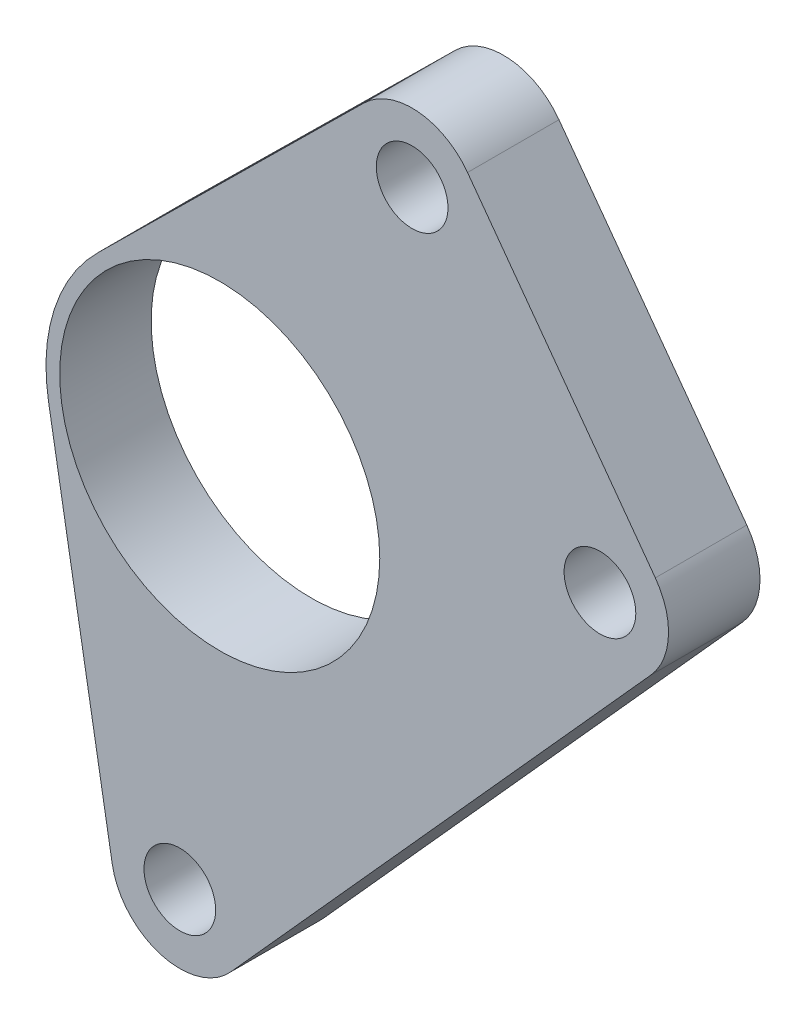
ISO-10303-21;
HEADER;
FILE_DESCRIPTION(('STEP AP214'),'2;1');
FILE_NAME('part.step','',(''),(''),'','','');
FILE_SCHEMA(('AUTOMOTIVE_DESIGN { 1 0 10303 214 1 1 1 1 }'));
ENDSEC;
DATA;
#1=APPLICATION_CONTEXT('core data for automotive mechanical design processes');
#2=APPLICATION_PROTOCOL_DEFINITION('international standard','automotive_design',2000,#1);
#3=PRODUCT_CONTEXT('',#1,'mechanical');
#4=PRODUCT('Part','Part','',(#3));
#5=PRODUCT_RELATED_PRODUCT_CATEGORY('part','',(#4));
#6=PRODUCT_DEFINITION_FORMATION('','',#4);
#7=PRODUCT_DEFINITION_CONTEXT('part definition',#1,'design');
#8=PRODUCT_DEFINITION('design','',#6,#7);
#9=PRODUCT_DEFINITION_SHAPE('','',#8);
#10=(LENGTH_UNIT() NAMED_UNIT(*) SI_UNIT(.MILLI.,.METRE.));
#11=(NAMED_UNIT(*) PLANE_ANGLE_UNIT() SI_UNIT($,.RADIAN.));
#12=(NAMED_UNIT(*) SI_UNIT($,.STERADIAN.) SOLID_ANGLE_UNIT());
#13=UNCERTAINTY_MEASURE_WITH_UNIT(LENGTH_MEASURE(1.E-05),#10,'distance_accuracy_value','');
#14=(GEOMETRIC_REPRESENTATION_CONTEXT(3) GLOBAL_UNCERTAINTY_ASSIGNED_CONTEXT((#13)) GLOBAL_UNIT_ASSIGNED_CONTEXT((#10,
#11,#12)) REPRESENTATION_CONTEXT('',''));
#15=CARTESIAN_POINT('',(0.,0.,0.));
#16=DIRECTION('',(0.,0.,1.));
#17=DIRECTION('',(1.,0.,0.));
#18=AXIS2_PLACEMENT_3D('',#15,#16,#17);
#19=CARTESIAN_POINT('',(-12.0465578661128,189.428701429059,6.35));
#20=DIRECTION('',(0.,0.,1.));
#21=DIRECTION('',(1.,0.,0.));
#22=AXIS2_PLACEMENT_3D('',#19,#20,#21);
#23=PLANE('',#22);
#24=CARTESIAN_POINT('',(17.1253729645223,221.865892196908,6.35));
#25=DIRECTION('',(0.,0.,1.));
#26=DIRECTION('',(1.,0.,0.));
#27=AXIS2_PLACEMENT_3D('',#24,#25,#26);
#28=CIRCLE('',#27,2.48920000000001);
#29=CARTESIAN_POINT('',(19.6145729645223,221.865892196908,6.35));
#30=VERTEX_POINT('',#29);
#31=EDGE_CURVE('E194',#30,#30,#28,.T.);
#32=ORIENTED_EDGE('',*,*,#31,.F.);
#33=EDGE_LOOP('',(#32));
#34=FACE_BOUND('',#33,.T.);
#35=CARTESIAN_POINT('',(-9.27636887368145,216.273648983416,6.35));
#36=DIRECTION('',(0.,0.,1.));
#37=DIRECTION('',(1.,0.,0.));
#38=AXIS2_PLACEMENT_3D('',#35,#36,#37);
#39=CIRCLE('',#38,11.1125);
#40=CARTESIAN_POINT('',(1.83613112631855,216.273648983416,6.35));
#41=VERTEX_POINT('',#40);
#42=EDGE_CURVE('E140',#41,#41,#39,.T.);
#43=ORIENTED_EDGE('',*,*,#42,.F.);
#44=EDGE_LOOP('',(#43));
#45=FACE_BOUND('',#44,.T.);
#46=CARTESIAN_POINT('',(-12.0465578661128,189.428701429059,6.35));
#47=DIRECTION('',(0.,0.,1.));
#48=DIRECTION('',(1.,0.,0.));
#49=AXIS2_PLACEMENT_3D('',#46,#47,#48);
#50=CIRCLE('',#49,4.76250000000002);
#51=CARTESIAN_POINT('',(-16.7394547128537,188.617452123451,6.35));
#52=VERTEX_POINT('',#51);
#53=CARTESIAN_POINT('',(-8.50545044137652,186.244056322225,6.35));
#54=VERTEX_POINT('',#53);
#55=EDGE_CURVE('E151',#52,#54,#50,.T.);
#56=ORIENTED_EDGE('',*,*,#55,.T.);
#57=DIRECTION('',(0.668691885949275,0.743539616742512,0.));
#58=VECTOR('',#57,1.);
#59=CARTESIAN_POINT('',(20.6664803892585,218.681247090074,6.35));
#60=LINE('',#59,#58);
#61=CARTESIAN_POINT('',(20.6664803892585,218.681247090074,6.35));
#62=VERTEX_POINT('',#61);
#63=EDGE_CURVE('E99',#54,#62,#60,.T.);
#64=ORIENTED_EDGE('',*,*,#63,.T.);
#65=CARTESIAN_POINT('',(17.1253729645223,221.865892196908,6.35));
#66=DIRECTION('',(0.,0.,1.));
#67=DIRECTION('',(1.,0.,0.));
#68=AXIS2_PLACEMENT_3D('',#65,#66,#67);
#69=CIRCLE('',#68,4.7625);
#70=CARTESIAN_POINT('',(20.9713277582369,224.674813337613,6.35));
#71=VERTEX_POINT('',#70);
#72=EDGE_CURVE('E166',#62,#71,#69,.T.);
#73=ORIENTED_EDGE('',*,*,#72,.T.);
#74=DIRECTION('',(-0.589799714583876,0.807549562984699,0.));
#75=VECTOR('',#74,1.);
#76=CARTESIAN_POINT('',(7.92999939941096,242.530907120806,6.35));
#77=LINE('',#76,#75);
#78=CARTESIAN_POINT('',(7.92999939941096,242.530907120806,6.35));
#79=VERTEX_POINT('',#78);
#80=EDGE_CURVE('E179',#71,#79,#77,.T.);
#81=ORIENTED_EDGE('',*,*,#80,.T.);
#82=CARTESIAN_POINT('',(4.08404460569636,239.7219859801,6.35));
#83=DIRECTION('',(0.,0.,1.));
#84=DIRECTION('',(1.,0.,0.));
#85=AXIS2_PLACEMENT_3D('',#82,#83,#84);
#86=CIRCLE('',#85,4.76249999999997);
#87=CARTESIAN_POINT('',(0.738439264467511,243.111430057046,6.35));
#88=VERTEX_POINT('',#87);
#89=EDGE_CURVE('E118',#79,#88,#86,.T.);
#90=ORIENTED_EDGE('',*,*,#89,.T.);
#91=DIRECTION('',(-0.711694294371757,-0.702489310494249,0.));
#92=VECTOR('',#91,1.);
#93=CARTESIAN_POINT('',(-17.7519024047946,224.860240645011,6.35));
#94=LINE('',#93,#92);
#95=CARTESIAN_POINT('',(-17.7519024047946,224.860240645011,6.35));
#96=VERTEX_POINT('',#95);
#97=EDGE_CURVE('E112',#88,#96,#94,.T.);
#98=ORIENTED_EDGE('',*,*,#97,.T.);
#99=CARTESIAN_POINT('',(-9.27636887368145,216.273648983416,6.35));
#100=DIRECTION('',(0.,0.,1.));
#101=DIRECTION('',(1.,0.,0.));
#102=AXIS2_PLACEMENT_3D('',#99,#100,#101);
#103=CIRCLE('',#102,12.065);
#104=CARTESIAN_POINT('',(-21.1650408854252,214.218484075877,6.35));
#105=VERTEX_POINT('',#104);
#106=EDGE_CURVE('E116',#96,#105,#103,.T.);
#107=ORIENTED_EDGE('',*,*,#106,.T.);
#108=DIRECTION('',(0.170341061544883,-0.98538516467002,0.));
#109=VECTOR('',#108,1.);
#110=CARTESIAN_POINT('',(-16.7394547128537,188.617452123451,6.35));
#111=LINE('',#110,#109);
#112=EDGE_CURVE('E56',#105,#52,#111,.T.);
#113=ORIENTED_EDGE('',*,*,#112,.T.);
#114=EDGE_LOOP('',(#56,#64,#73,#81,#90,#98,#107,#113));
#115=FACE_BOUND('',#114,.T.);
#116=CARTESIAN_POINT('',(4.08404460569636,239.7219859801,6.35));
#117=DIRECTION('',(0.,0.,1.));
#118=DIRECTION('',(1.,0.,0.));
#119=AXIS2_PLACEMENT_3D('',#116,#117,#118);
#120=CIRCLE('',#119,2.48920000000002);
#121=CARTESIAN_POINT('',(6.57324460569637,239.7219859801,6.35));
#122=VERTEX_POINT('',#121);
#123=EDGE_CURVE('E188',#122,#122,#120,.T.);
#124=ORIENTED_EDGE('',*,*,#123,.F.);
#125=EDGE_LOOP('',(#124));
#126=FACE_BOUND('',#125,.T.);
#127=CARTESIAN_POINT('',(-12.0465578661128,189.428701429059,6.35));
#128=DIRECTION('',(0.,0.,1.));
#129=DIRECTION('',(1.,0.,0.));
#130=AXIS2_PLACEMENT_3D('',#127,#128,#129);
#131=CIRCLE('',#130,2.48920000000001);
#132=CARTESIAN_POINT('',(-9.55735786611275,189.428701429059,6.35));
#133=VERTEX_POINT('',#132);
#134=EDGE_CURVE('E200',#133,#133,#131,.T.);
#135=ORIENTED_EDGE('',*,*,#134,.F.);
#136=EDGE_LOOP('',(#135));
#137=FACE_BOUND('',#136,.T.);
#138=ADVANCED_FACE('F39',(#34,#45,#115,#126,#137),#23,.T.);
#139=CARTESIAN_POINT('',(-12.0465578661128,189.428701429059,0.));
#140=DIRECTION('',(0.,0.,1.));
#141=DIRECTION('',(1.,0.,0.));
#142=AXIS2_PLACEMENT_3D('',#139,#140,#141);
#143=PLANE('',#142);
#144=CARTESIAN_POINT('',(-12.0465578661128,189.428701429059,0.));
#145=DIRECTION('',(0.,0.,1.));
#146=DIRECTION('',(1.,0.,0.));
#147=AXIS2_PLACEMENT_3D('',#144,#145,#146);
#148=CIRCLE('',#147,4.76250000000002);
#149=CARTESIAN_POINT('',(-16.7394547128537,188.617452123451,0.));
#150=VERTEX_POINT('',#149);
#151=CARTESIAN_POINT('',(-8.50545044137652,186.244056322225,0.));
#152=VERTEX_POINT('',#151);
#153=EDGE_CURVE('E136',#150,#152,#148,.T.);
#154=ORIENTED_EDGE('',*,*,#153,.F.);
#155=DIRECTION('',(0.170341061544883,-0.98538516467002,0.));
#156=VECTOR('',#155,1.);
#157=CARTESIAN_POINT('',(-16.7394547128537,188.617452123451,0.));
#158=LINE('',#157,#156);
#159=CARTESIAN_POINT('',(-21.1650408854252,214.218484075877,0.));
#160=VERTEX_POINT('',#159);
#161=EDGE_CURVE('E91',#160,#150,#158,.T.);
#162=ORIENTED_EDGE('',*,*,#161,.F.);
#163=CARTESIAN_POINT('',(-9.27636887368145,216.273648983416,0.));
#164=DIRECTION('',(0.,0.,1.));
#165=DIRECTION('',(1.,0.,0.));
#166=AXIS2_PLACEMENT_3D('',#163,#164,#165);
#167=CIRCLE('',#166,12.065);
#168=CARTESIAN_POINT('',(-17.7519024047946,224.860240645011,0.));
#169=VERTEX_POINT('',#168);
#170=EDGE_CURVE('E85',#169,#160,#167,.T.);
#171=ORIENTED_EDGE('',*,*,#170,.F.);
#172=DIRECTION('',(-0.711694294371757,-0.702489310494249,0.));
#173=VECTOR('',#172,1.);
#174=CARTESIAN_POINT('',(-17.7519024047946,224.860240645011,0.));
#175=LINE('',#174,#173);
#176=CARTESIAN_POINT('',(0.738439264467511,243.111430057046,0.));
#177=VERTEX_POINT('',#176);
#178=EDGE_CURVE('E126',#177,#169,#175,.T.);
#179=ORIENTED_EDGE('',*,*,#178,.F.);
#180=CARTESIAN_POINT('',(4.08404460569636,239.7219859801,0.));
#181=DIRECTION('',(0.,0.,1.));
#182=DIRECTION('',(1.,0.,0.));
#183=AXIS2_PLACEMENT_3D('',#180,#181,#182);
#184=CIRCLE('',#183,4.76249999999997);
#185=CARTESIAN_POINT('',(7.92999939941096,242.530907120806,0.));
#186=VERTEX_POINT('',#185);
#187=EDGE_CURVE('E146',#186,#177,#184,.T.);
#188=ORIENTED_EDGE('',*,*,#187,.F.);
#189=DIRECTION('',(-0.589799714583876,0.807549562984699,0.));
#190=VECTOR('',#189,1.);
#191=CARTESIAN_POINT('',(7.92999939941096,242.530907120806,0.));
#192=LINE('',#191,#190);
#193=CARTESIAN_POINT('',(20.9713277582369,224.674813337613,0.));
#194=VERTEX_POINT('',#193);
#195=EDGE_CURVE('E144',#194,#186,#192,.T.);
#196=ORIENTED_EDGE('',*,*,#195,.F.);
#197=CARTESIAN_POINT('',(17.1253729645223,221.865892196908,0.));
#198=DIRECTION('',(0.,0.,1.));
#199=DIRECTION('',(1.,0.,0.));
#200=AXIS2_PLACEMENT_3D('',#197,#198,#199);
#201=CIRCLE('',#200,4.7625);
#202=CARTESIAN_POINT('',(20.6664803892585,218.681247090074,0.));
#203=VERTEX_POINT('',#202);
#204=EDGE_CURVE('E142',#203,#194,#201,.T.);
#205=ORIENTED_EDGE('',*,*,#204,.F.);
#206=DIRECTION('',(0.668691885949275,0.743539616742512,0.));
#207=VECTOR('',#206,1.);
#208=CARTESIAN_POINT('',(20.6664803892585,218.681247090074,0.));
#209=LINE('',#208,#207);
#210=EDGE_CURVE('E139',#152,#203,#209,.T.);
#211=ORIENTED_EDGE('',*,*,#210,.F.);
#212=EDGE_LOOP('',(#154,#162,#171,#179,#188,#196,#205,#211));
#213=FACE_BOUND('',#212,.T.);
#214=CARTESIAN_POINT('',(-9.27636887368145,216.273648983416,0.));
#215=DIRECTION('',(0.,0.,1.));
#216=DIRECTION('',(1.,0.,0.));
#217=AXIS2_PLACEMENT_3D('',#214,#215,#216);
#218=CIRCLE('',#217,11.1125);
#219=CARTESIAN_POINT('',(1.83613112631855,216.273648983416,0.));
#220=VERTEX_POINT('',#219);
#221=EDGE_CURVE('E185',#220,#220,#218,.T.);
#222=ORIENTED_EDGE('',*,*,#221,.T.);
#223=EDGE_LOOP('',(#222));
#224=FACE_BOUND('',#223,.T.);
#225=CARTESIAN_POINT('',(4.08404460569636,239.7219859801,0.));
#226=DIRECTION('',(0.,0.,1.));
#227=DIRECTION('',(1.,0.,0.));
#228=AXIS2_PLACEMENT_3D('',#225,#226,#227);
#229=CIRCLE('',#228,2.48920000000002);
#230=CARTESIAN_POINT('',(6.57324460569637,239.7219859801,0.));
#231=VERTEX_POINT('',#230);
#232=EDGE_CURVE('E191',#231,#231,#229,.T.);
#233=ORIENTED_EDGE('',*,*,#232,.T.);
#234=EDGE_LOOP('',(#233));
#235=FACE_BOUND('',#234,.T.);
#236=CARTESIAN_POINT('',(17.1253729645223,221.865892196908,0.));
#237=DIRECTION('',(0.,0.,1.));
#238=DIRECTION('',(1.,0.,0.));
#239=AXIS2_PLACEMENT_3D('',#236,#237,#238);
#240=CIRCLE('',#239,2.48920000000001);
#241=CARTESIAN_POINT('',(19.6145729645223,221.865892196908,0.));
#242=VERTEX_POINT('',#241);
#243=EDGE_CURVE('E197',#242,#242,#240,.T.);
#244=ORIENTED_EDGE('',*,*,#243,.T.);
#245=EDGE_LOOP('',(#244));
#246=FACE_BOUND('',#245,.T.);
#247=CARTESIAN_POINT('',(-12.0465578661128,189.428701429059,0.));
#248=DIRECTION('',(0.,0.,1.));
#249=DIRECTION('',(1.,0.,0.));
#250=AXIS2_PLACEMENT_3D('',#247,#248,#249);
#251=CIRCLE('',#250,2.48920000000001);
#252=CARTESIAN_POINT('',(-9.55735786611275,189.428701429059,0.));
#253=VERTEX_POINT('',#252);
#254=EDGE_CURVE('E203',#253,#253,#251,.T.);
#255=ORIENTED_EDGE('',*,*,#254,.T.);
#256=EDGE_LOOP('',(#255));
#257=FACE_BOUND('',#256,.T.);
#258=ADVANCED_FACE('F170',(#213,#224,#235,#246,#257),#143,.F.);
#259=CARTESIAN_POINT('',(-12.0465578661128,189.428701429059,6.35));
#260=DIRECTION('',(0.,0.,-1.));
#261=DIRECTION('',(-1.,0.,0.));
#262=AXIS2_PLACEMENT_3D('',#259,#260,#261);
#263=CYLINDRICAL_SURFACE('',#262,4.76250000000002);
#264=ORIENTED_EDGE('',*,*,#153,.T.);
#265=DIRECTION('',(0.,0.,-1.));
#266=VECTOR('',#265,1.);
#267=CARTESIAN_POINT('',(-8.50545044137652,186.244056322225,6.35));
#268=LINE('',#267,#266);
#269=EDGE_CURVE('E11',#54,#152,#268,.T.);
#270=ORIENTED_EDGE('',*,*,#269,.F.);
#271=ORIENTED_EDGE('',*,*,#55,.F.);
#272=DIRECTION('',(0.,0.,-1.));
#273=VECTOR('',#272,1.);
#274=CARTESIAN_POINT('',(-16.7394547128537,188.617452123451,6.35));
#275=LINE('',#274,#273);
#276=EDGE_CURVE('E132',#52,#150,#275,.T.);
#277=ORIENTED_EDGE('',*,*,#276,.T.);
#278=EDGE_LOOP('',(#264,#270,#271,#277));
#279=FACE_BOUND('',#278,.T.);
#280=ADVANCED_FACE('F41',(#279),#263,.T.);
#281=CARTESIAN_POINT('',(20.6664803892585,218.681247090074,6.35));
#282=DIRECTION('',(-0.743539616742512,0.668691885949275,0.));
#283=DIRECTION('',(-0.668691885949275,-0.743539616742512,0.));
#284=AXIS2_PLACEMENT_3D('',#281,#282,#283);
#285=PLANE('',#284);
#286=ORIENTED_EDGE('',*,*,#210,.T.);
#287=DIRECTION('',(0.,0.,-1.));
#288=VECTOR('',#287,1.);
#289=CARTESIAN_POINT('',(20.6664803892585,218.681247090074,6.35));
#290=LINE('',#289,#288);
#291=EDGE_CURVE('E48',#62,#203,#290,.T.);
#292=ORIENTED_EDGE('',*,*,#291,.F.);
#293=ORIENTED_EDGE('',*,*,#63,.F.);
#294=ORIENTED_EDGE('',*,*,#269,.T.);
#295=EDGE_LOOP('',(#286,#292,#293,#294));
#296=FACE_BOUND('',#295,.T.);
#297=ADVANCED_FACE('F237',(#296),#285,.F.);
#298=CARTESIAN_POINT('',(17.1253729645223,221.865892196908,6.35));
#299=DIRECTION('',(0.,0.,-1.));
#300=DIRECTION('',(-1.,0.,0.));
#301=AXIS2_PLACEMENT_3D('',#298,#299,#300);
#302=CYLINDRICAL_SURFACE('',#301,4.7625);
#303=ORIENTED_EDGE('',*,*,#204,.T.);
#304=DIRECTION('',(0.,0.,-1.));
#305=VECTOR('',#304,1.);
#306=CARTESIAN_POINT('',(20.9713277582369,224.674813337613,6.35));
#307=LINE('',#306,#305);
#308=EDGE_CURVE('E158',#71,#194,#307,.T.);
#309=ORIENTED_EDGE('',*,*,#308,.F.);
#310=ORIENTED_EDGE('',*,*,#72,.F.);
#311=ORIENTED_EDGE('',*,*,#291,.T.);
#312=EDGE_LOOP('',(#303,#309,#310,#311));
#313=FACE_BOUND('',#312,.T.);
#314=ADVANCED_FACE('F164',(#313),#302,.T.);
#315=CARTESIAN_POINT('',(7.92999939941096,242.530907120806,6.35));
#316=DIRECTION('',(-0.807549562984699,-0.589799714583876,0.));
#317=DIRECTION('',(0.589799714583876,-0.807549562984699,0.));
#318=AXIS2_PLACEMENT_3D('',#315,#316,#317);
#319=PLANE('',#318);
#320=ORIENTED_EDGE('',*,*,#195,.T.);
#321=DIRECTION('',(0.,0.,-1.));
#322=VECTOR('',#321,1.);
#323=CARTESIAN_POINT('',(7.92999939941096,242.530907120806,6.35));
#324=LINE('',#323,#322);
#325=EDGE_CURVE('E155',#79,#186,#324,.T.);
#326=ORIENTED_EDGE('',*,*,#325,.F.);
#327=ORIENTED_EDGE('',*,*,#80,.F.);
#328=ORIENTED_EDGE('',*,*,#308,.T.);
#329=EDGE_LOOP('',(#320,#326,#327,#328));
#330=FACE_BOUND('',#329,.T.);
#331=ADVANCED_FACE('F175',(#330),#319,.F.);
#332=CARTESIAN_POINT('',(4.08404460569636,239.7219859801,6.35));
#333=DIRECTION('',(0.,0.,-1.));
#334=DIRECTION('',(-1.,0.,0.));
#335=AXIS2_PLACEMENT_3D('',#332,#333,#334);
#336=CYLINDRICAL_SURFACE('',#335,4.76249999999997);
#337=ORIENTED_EDGE('',*,*,#187,.T.);
#338=DIRECTION('',(0.,0.,-1.));
#339=VECTOR('',#338,1.);
#340=CARTESIAN_POINT('',(0.738439264467511,243.111430057046,6.35));
#341=LINE('',#340,#339);
#342=EDGE_CURVE('E127',#88,#177,#341,.T.);
#343=ORIENTED_EDGE('',*,*,#342,.F.);
#344=ORIENTED_EDGE('',*,*,#89,.F.);
#345=ORIENTED_EDGE('',*,*,#325,.T.);
#346=EDGE_LOOP('',(#337,#343,#344,#345));
#347=FACE_BOUND('',#346,.T.);
#348=ADVANCED_FACE('F178',(#347),#336,.T.);
#349=CARTESIAN_POINT('',(-17.7519024047946,224.860240645011,6.35));
#350=DIRECTION('',(0.70248931049425,-0.711694294371758,0.));
#351=DIRECTION('',(0.711694294371758,0.70248931049425,0.));
#352=AXIS2_PLACEMENT_3D('',#349,#350,#351);
#353=PLANE('',#352);
#354=ORIENTED_EDGE('',*,*,#178,.T.);
#355=DIRECTION('',(0.,0.,-1.));
#356=VECTOR('',#355,1.);
#357=CARTESIAN_POINT('',(-17.7519024047946,224.860240645011,6.35));
#358=LINE('',#357,#356);
#359=EDGE_CURVE('E123',#96,#169,#358,.T.);
#360=ORIENTED_EDGE('',*,*,#359,.F.);
#361=ORIENTED_EDGE('',*,*,#97,.F.);
#362=ORIENTED_EDGE('',*,*,#342,.T.);
#363=EDGE_LOOP('',(#354,#360,#361,#362));
#364=FACE_BOUND('',#363,.T.);
#365=ADVANCED_FACE('F124',(#364),#353,.F.);
#366=CARTESIAN_POINT('',(-9.27636887368145,216.273648983416,6.35));
#367=DIRECTION('',(0.,0.,-1.));
#368=DIRECTION('',(-1.,0.,0.));
#369=AXIS2_PLACEMENT_3D('',#366,#367,#368);
#370=CYLINDRICAL_SURFACE('',#369,12.065);
#371=ORIENTED_EDGE('',*,*,#170,.T.);
#372=DIRECTION('',(0.,0.,-1.));
#373=VECTOR('',#372,1.);
#374=CARTESIAN_POINT('',(-21.1650408854252,214.218484075877,6.35));
#375=LINE('',#374,#373);
#376=EDGE_CURVE('E128',#105,#160,#375,.T.);
#377=ORIENTED_EDGE('',*,*,#376,.F.);
#378=ORIENTED_EDGE('',*,*,#106,.F.);
#379=ORIENTED_EDGE('',*,*,#359,.T.);
#380=EDGE_LOOP('',(#371,#377,#378,#379));
#381=FACE_BOUND('',#380,.T.);
#382=ADVANCED_FACE('F130',(#381),#370,.T.);
#383=CARTESIAN_POINT('',(-16.7394547128537,188.617452123451,6.35));
#384=DIRECTION('',(0.98538516467002,0.170341061544883,0.));
#385=DIRECTION('',(-0.170341061544883,0.98538516467002,0.));
#386=AXIS2_PLACEMENT_3D('',#383,#384,#385);
#387=PLANE('',#386);
#388=ORIENTED_EDGE('',*,*,#161,.T.);
#389=ORIENTED_EDGE('',*,*,#276,.F.);
#390=ORIENTED_EDGE('',*,*,#112,.F.);
#391=ORIENTED_EDGE('',*,*,#376,.T.);
#392=EDGE_LOOP('',(#388,#389,#390,#391));
#393=FACE_BOUND('',#392,.T.);
#394=ADVANCED_FACE('F225',(#393),#387,.F.);
#395=CARTESIAN_POINT('',(-9.27636887368145,216.273648983416,6.35));
#396=DIRECTION('',(0.,0.,-1.));
#397=DIRECTION('',(-1.,0.,0.));
#398=AXIS2_PLACEMENT_3D('',#395,#396,#397);
#399=CYLINDRICAL_SURFACE('',#398,11.1125);
#400=ORIENTED_EDGE('',*,*,#42,.T.);
#401=EDGE_LOOP('',(#400));
#402=FACE_BOUND('',#401,.T.);
#403=ORIENTED_EDGE('',*,*,#221,.F.);
#404=EDGE_LOOP('',(#403));
#405=FACE_BOUND('',#404,.T.);
#406=ADVANCED_FACE('F222',(#402,#405),#399,.F.);
#407=CARTESIAN_POINT('',(4.08404460569636,239.7219859801,6.35));
#408=DIRECTION('',(0.,0.,-1.));
#409=DIRECTION('',(-1.,0.,0.));
#410=AXIS2_PLACEMENT_3D('',#407,#408,#409);
#411=CYLINDRICAL_SURFACE('',#410,2.48920000000002);
#412=ORIENTED_EDGE('',*,*,#123,.T.);
#413=EDGE_LOOP('',(#412));
#414=FACE_BOUND('',#413,.T.);
#415=ORIENTED_EDGE('',*,*,#232,.F.);
#416=EDGE_LOOP('',(#415));
#417=FACE_BOUND('',#416,.T.);
#418=ADVANCED_FACE('F313',(#414,#417),#411,.F.);
#419=CARTESIAN_POINT('',(17.1253729645223,221.865892196908,6.35));
#420=DIRECTION('',(0.,0.,-1.));
#421=DIRECTION('',(-1.,0.,0.));
#422=AXIS2_PLACEMENT_3D('',#419,#420,#421);
#423=CYLINDRICAL_SURFACE('',#422,2.48920000000001);
#424=ORIENTED_EDGE('',*,*,#31,.T.);
#425=EDGE_LOOP('',(#424));
#426=FACE_BOUND('',#425,.T.);
#427=ORIENTED_EDGE('',*,*,#243,.F.);
#428=EDGE_LOOP('',(#427));
#429=FACE_BOUND('',#428,.T.);
#430=ADVANCED_FACE('F322',(#426,#429),#423,.F.);
#431=CARTESIAN_POINT('',(-12.0465578661128,189.428701429059,6.35));
#432=DIRECTION('',(0.,0.,-1.));
#433=DIRECTION('',(-1.,0.,0.));
#434=AXIS2_PLACEMENT_3D('',#431,#432,#433);
#435=CYLINDRICAL_SURFACE('',#434,2.48920000000001);
#436=ORIENTED_EDGE('',*,*,#134,.T.);
#437=EDGE_LOOP('',(#436));
#438=FACE_BOUND('',#437,.T.);
#439=ORIENTED_EDGE('',*,*,#254,.F.);
#440=EDGE_LOOP('',(#439));
#441=FACE_BOUND('',#440,.T.);
#442=ADVANCED_FACE('F209',(#438,#441),#435,.F.);
#443=CLOSED_SHELL('',(#138,#258,#280,#297,#314,#331,#348,#365,#382,#394,#406,#418,#430,#442));
#444=MANIFOLD_SOLID_BREP('B2',#443);
#445=ADVANCED_BREP_SHAPE_REPRESENTATION('',(#18,#444),#14);
#446=SHAPE_DEFINITION_REPRESENTATION(#9,#445);
ENDSEC;
END-ISO-10303-21;
